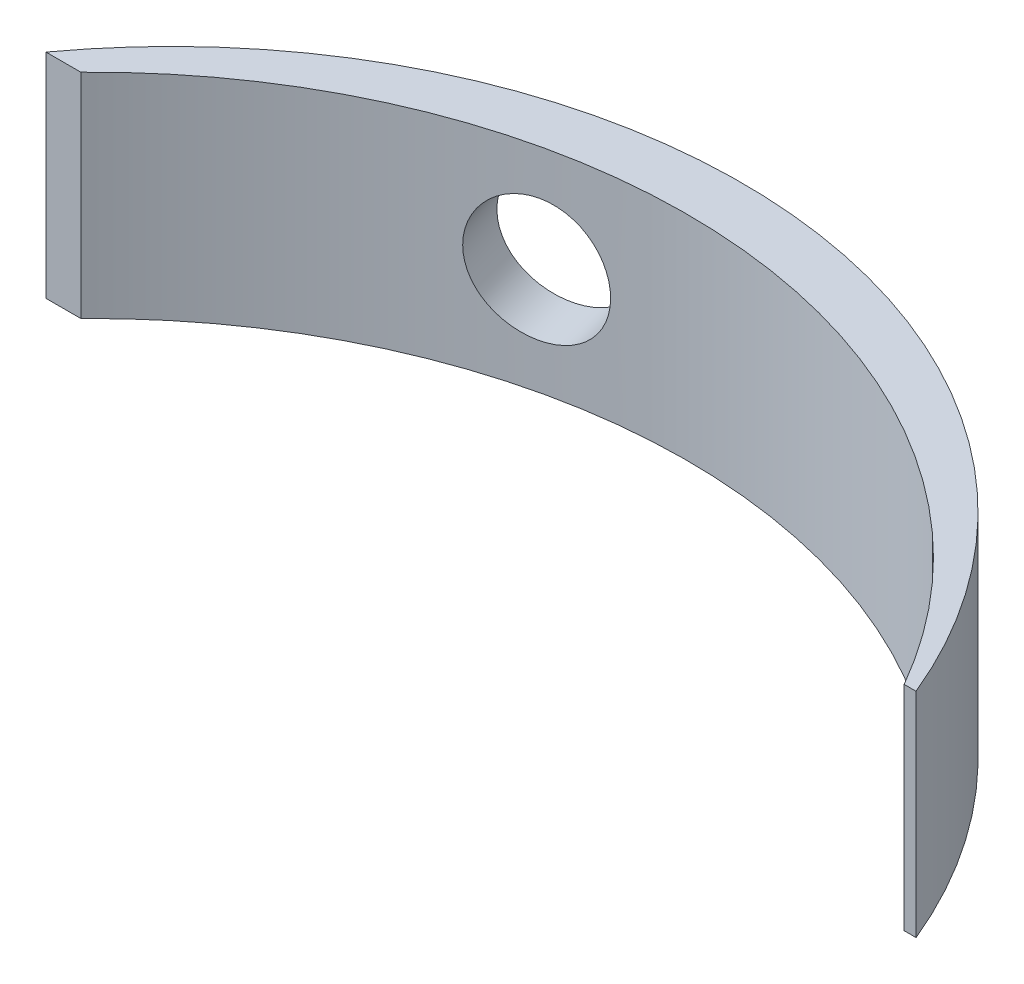
ISO-10303-21;
HEADER;
FILE_DESCRIPTION(('STEP AP214'),'2;1');
FILE_NAME('part.step','',(''),(''),'','','');
FILE_SCHEMA(('AUTOMOTIVE_DESIGN { 1 0 10303 214 1 1 1 1 }'));
ENDSEC;
DATA;
#1=APPLICATION_CONTEXT('core data for automotive mechanical design processes');
#2=APPLICATION_PROTOCOL_DEFINITION('international standard','automotive_design',2000,#1);
#3=PRODUCT_CONTEXT('',#1,'mechanical');
#4=PRODUCT('Part','Part','',(#3));
#5=PRODUCT_RELATED_PRODUCT_CATEGORY('part','',(#4));
#6=PRODUCT_DEFINITION_FORMATION('','',#4);
#7=PRODUCT_DEFINITION_CONTEXT('part definition',#1,'design');
#8=PRODUCT_DEFINITION('design','',#6,#7);
#9=PRODUCT_DEFINITION_SHAPE('','',#8);
#10=(LENGTH_UNIT() NAMED_UNIT(*) SI_UNIT(.MILLI.,.METRE.));
#11=(NAMED_UNIT(*) PLANE_ANGLE_UNIT() SI_UNIT($,.RADIAN.));
#12=(NAMED_UNIT(*) SI_UNIT($,.STERADIAN.) SOLID_ANGLE_UNIT());
#13=UNCERTAINTY_MEASURE_WITH_UNIT(LENGTH_MEASURE(1.E-05),#10,'distance_accuracy_value','');
#14=(GEOMETRIC_REPRESENTATION_CONTEXT(3) GLOBAL_UNCERTAINTY_ASSIGNED_CONTEXT((#13)) GLOBAL_UNIT_ASSIGNED_CONTEXT((#10,
#11,#12)) REPRESENTATION_CONTEXT('',''));
#15=CARTESIAN_POINT('',(0.,0.,0.));
#16=DIRECTION('',(0.,0.,1.));
#17=DIRECTION('',(1.,0.,0.));
#18=AXIS2_PLACEMENT_3D('',#15,#16,#17);
#19=CARTESIAN_POINT('',(141.2875,57.15,58.1840058724832));
#20=DIRECTION('',(0.,-1.,0.));
#21=DIRECTION('',(0.,0.,-1.));
#22=AXIS2_PLACEMENT_3D('',#19,#20,#21);
#23=CYLINDRICAL_SURFACE('',#22,152.799005872483);
#24=CARTESIAN_POINT('',(86.0222558572413,28.575,-84.2705096244305));
#25=CARTESIAN_POINT('',(86.0222515503944,28.1120989758111,-84.2705069842389));
#26=CARTESIAN_POINT('',(86.04048623744,27.6492703304217,-84.2775858667872));
#27=CARTESIAN_POINT('',(86.1133049194062,26.7267608318967,-84.305804245029));
#28=CARTESIAN_POINT('',(86.1678974804124,26.2670807463676,-84.3269470542482));
#29=CARTESIAN_POINT('',(86.3131475939382,25.3538775854863,-84.3830408276301));
#30=CARTESIAN_POINT('',(86.4038399757346,24.9003608948781,-84.4180051266058));
#31=CARTESIAN_POINT('',(86.6207150127373,24.0030819733926,-84.5012852999568));
#32=CARTESIAN_POINT('',(86.7468975958275,23.5593197226962,-84.5496011472017));
#33=CARTESIAN_POINT('',(86.9620759404712,22.9036043290434,-84.631575652475));
#34=CARTESIAN_POINT('',(87.0381089355589,22.6867122787247,-84.6604799602388));
#35=CARTESIAN_POINT('',(87.1986747178071,22.2565992461378,-84.7213563460328));
#36=CARTESIAN_POINT('',(87.2832053217454,22.0433773373347,-84.7533276359919));
#37=CARTESIAN_POINT('',(87.5493953705119,21.4096595127873,-84.8537106403135));
#38=CARTESIAN_POINT('',(87.7436645114961,20.9950765828764,-84.9265958703674));
#39=CARTESIAN_POINT('',(88.1644218912166,20.1849414359681,-85.0833145893145));
#40=CARTESIAN_POINT('',(88.3909034685734,19.7893853068937,-85.1671458143346));
#41=CARTESIAN_POINT('',(88.8746713400905,19.0199124348961,-85.344729760026));
#42=CARTESIAN_POINT('',(89.1319575975992,18.645995666227,-85.4384824688925));
#43=CARTESIAN_POINT('',(89.6764049576062,17.921443116995,-85.6350298155276));
#44=CARTESIAN_POINT('',(89.9636460154305,17.5708739601232,-85.7378485332677));
#45=CARTESIAN_POINT('',(90.5655429967052,16.896604476723,-85.9510737509749));
#46=CARTESIAN_POINT('',(90.8801989929475,16.5729042215412,-86.061480271089));
#47=CARTESIAN_POINT('',(91.5348732798131,15.954646883853,-86.2885948106701));
#48=CARTESIAN_POINT('',(91.8748925562685,15.6600909351779,-86.4053030750276));
#49=CARTESIAN_POINT('',(92.5780359753195,15.1022243783186,-86.6436920631989));
#50=CARTESIAN_POINT('',(92.9411601075039,14.8389137560553,-86.765372784772));
#51=CARTESIAN_POINT('',(93.6884594525961,14.345172118452,-87.0124904276878));
#52=CARTESIAN_POINT('',(94.0726550037301,14.1147736714616,-87.1379309230865));
#53=CARTESIAN_POINT('',(94.8591751771982,13.6888203214894,-87.3911207903362));
#54=CARTESIAN_POINT('',(95.2614998192259,13.4932654563594,-87.5188701646952));
#55=CARTESIAN_POINT('',(96.0815159028412,13.1384181442859,-87.7753710943444));
#56=CARTESIAN_POINT('',(96.4992069619543,12.9791247954914,-87.9041226246278));
#57=CARTESIAN_POINT('',(97.347071698854,12.6979518765491,-88.1613773762201));
#58=CARTESIAN_POINT('',(97.7772453288849,12.5760721632853,-88.289880598477));
#59=CARTESIAN_POINT('',(98.6453007720827,12.3710277325129,-88.5449375765527));
#60=CARTESIAN_POINT('',(99.0831443870586,12.2877084742293,-88.6714971137697));
#61=CARTESIAN_POINT('',(99.9651455716714,12.1596576328693,-88.9221102213036));
#62=CARTESIAN_POINT('',(100.409303124548,12.1149259473793,-89.0461637982706));
#63=CARTESIAN_POINT('',(101.300773062489,12.0643633955629,-89.2907767042696));
#64=CARTESIAN_POINT('',(101.748085382196,12.058531725683,-89.4113361054293));
#65=CARTESIAN_POINT('',(102.642678773969,12.0857917194742,-89.6480883297807));
#66=CARTESIAN_POINT('',(103.089959846065,12.1188833464588,-89.764281157088));
#67=CARTESIAN_POINT('',(103.980041285758,12.2235817925819,-89.9912285040665));
#68=CARTESIAN_POINT('',(104.422850643132,12.2950814740132,-90.1019972206833));
#69=CARTESIAN_POINT('',(105.302071674156,12.4759884265698,-90.3178124895098));
#70=CARTESIAN_POINT('',(105.738483363205,12.5853956064305,-90.4228590554955));
#71=CARTESIAN_POINT('',(106.601785552511,12.8413127547695,-90.6267267489958));
#72=CARTESIAN_POINT('',(107.028675873753,12.987823420207,-90.725547759525));
#73=CARTESIAN_POINT('',(107.869860396199,13.3168828861597,-90.9165762954052));
#74=CARTESIAN_POINT('',(108.284154546397,13.4994318325837,-91.0087837939779));
#75=CARTESIAN_POINT('',(109.098659961975,13.8999963781927,-91.1866378145082));
#76=CARTESIAN_POINT('',(109.498813876352,14.1181398540815,-91.2722589790919));
#77=CARTESIAN_POINT('',(110.280523317159,14.5878610340486,-91.4363908782332));
#78=CARTESIAN_POINT('',(110.662078805175,14.8394388071813,-91.5149015981046));
#79=CARTESIAN_POINT('',(111.403823703038,15.3742660089472,-91.6647354601562));
#80=CARTESIAN_POINT('',(111.764012404391,15.6575164869086,-91.7360583640527));
#81=CARTESIAN_POINT('',(112.460372251684,16.2537052095002,-91.8715130164475));
#82=CARTESIAN_POINT('',(112.796543315286,16.5666435558976,-91.9356447402934));
#83=CARTESIAN_POINT('',(113.444155050499,17.2218259288622,-92.057112000611));
#84=CARTESIAN_POINT('',(113.755450283356,17.56422098973,-92.1144084153545));
#85=CARTESIAN_POINT('',(114.348904519545,18.2744338425496,-92.2219090308153));
#86=CARTESIAN_POINT('',(114.631063402939,18.6422517391431,-92.272113202338));
#87=CARTESIAN_POINT('',(115.164091376434,19.4007339156456,-92.3655771942467));
#88=CARTESIAN_POINT('',(115.414960496663,19.7913981735559,-92.4088370213193));
#89=CARTESIAN_POINT('',(115.883468234323,20.5928281852812,-92.4885790899051));
#90=CARTESIAN_POINT('',(116.10110694393,21.0035938833342,-92.5250613502182));
#91=CARTESIAN_POINT('',(116.501234032199,21.8418807727248,-92.5913844354674));
#92=CARTESIAN_POINT('',(116.683759494648,22.2693837066541,-92.6212322723852));
#93=CARTESIAN_POINT('',(117.012497044133,23.1385211732984,-92.6744979539591));
#94=CARTESIAN_POINT('',(117.158709129941,23.5801557064917,-92.6979157983975));
#95=CARTESIAN_POINT('',(117.413637575048,24.4743819955906,-92.7384628473561));
#96=CARTESIAN_POINT('',(117.522355407898,24.9269733201381,-92.7555922990164));
#97=CARTESIAN_POINT('',(117.701417567114,25.8398725247844,-92.783676560031));
#98=CARTESIAN_POINT('',(117.77176211262,26.3001803608004,-92.7946314046471));
#99=CARTESIAN_POINT('',(117.873148926086,27.2219813944591,-92.8103879850259));
#100=CARTESIAN_POINT('',(117.904459791969,27.6834443479569,-92.8152317748855));
#101=CARTESIAN_POINT('',(117.928414421067,28.6073957051582,-92.8189393520571));
#102=CARTESIAN_POINT('',(117.921058365552,29.0698841040443,-92.8178031674032));
#103=CARTESIAN_POINT('',(117.867739858575,29.9925662383112,-92.8095428431166));
#104=CARTESIAN_POINT('',(117.821778183052,30.4527600196249,-92.8024188238341));
#105=CARTESIAN_POINT('',(117.691622922896,31.3675733814978,-92.7821330765807));
#106=CARTESIAN_POINT('',(117.607429353549,31.8221929642858,-92.7689713510238));
#107=CARTESIAN_POINT('',(117.401815197561,32.7212013622425,-92.7365727038969));
#108=CARTESIAN_POINT('',(117.280512721367,33.165617895304,-92.7173550514113));
#109=CARTESIAN_POINT('',(117.001557003077,34.0425686973351,-92.672711252714));
#110=CARTESIAN_POINT('',(116.843903866996,34.4751030009546,-92.647285124609));
#111=CARTESIAN_POINT('',(116.493480465555,35.3252792790061,-92.5900777293418));
#112=CARTESIAN_POINT('',(116.300709355356,35.7429208948732,-92.5582963092875));
#113=CARTESIAN_POINT('',(115.881545290611,36.5604056815401,-92.4882171401426));
#114=CARTESIAN_POINT('',(115.655152159898,36.9602487590677,-92.4499193569085));
#115=CARTESIAN_POINT('',(115.169234308771,37.7413698714897,-92.3664290214586));
#116=CARTESIAN_POINT('',(114.909546318825,38.1225426874163,-92.3212022626046));
#117=CARTESIAN_POINT('',(114.359925166068,38.8614806243717,-92.2238389034061));
#118=CARTESIAN_POINT('',(114.069991915617,39.2192456775684,-92.1717022830391));
#119=CARTESIAN_POINT('',(113.462045786204,39.9089064311352,-92.0603809228614));
#120=CARTESIAN_POINT('',(113.144031936417,40.2408012363507,-92.0011959393442));
#121=CARTESIAN_POINT('',(112.482292712296,40.8764123829126,-91.8756809619608));
#122=CARTESIAN_POINT('',(112.138567247538,41.180128625152,-91.8093509429665));
#123=CARTESIAN_POINT('',(111.425753169535,41.7590426603478,-91.6690721452277));
#124=CARTESIAN_POINT('',(111.056522077413,42.0340543460987,-91.5950791820544));
#125=CARTESIAN_POINT('',(110.297318593785,42.5514719509362,-91.4398389733313));
#126=CARTESIAN_POINT('',(109.907346107994,42.793877721786,-91.3585916948039));
#127=CARTESIAN_POINT('',(109.10953164929,43.2443500706132,-91.1889529967007));
#128=CARTESIAN_POINT('',(108.701689756252,43.4524168020635,-91.1005616090569));
#129=CARTESIAN_POINT('',(107.87112826195,43.8327077629825,-90.9168431061636));
#130=CARTESIAN_POINT('',(107.448408703582,44.0049320957825,-90.8215160109103));
#131=CARTESIAN_POINT('',(106.591663591981,44.312106588331,-90.6243545050195));
#132=CARTESIAN_POINT('',(106.157651108863,44.4470979090886,-90.5225274347496));
#133=CARTESIAN_POINT('',(105.281038610272,44.6790579553443,-90.3127080133477));
#134=CARTESIAN_POINT('',(104.83843859505,44.7760266819536,-90.204715662396));
#135=CARTESIAN_POINT('',(103.947891918558,44.9312072562735,-89.9831308014225));
#136=CARTESIAN_POINT('',(103.499945419533,44.9894202770389,-89.8695384610127));
#137=CARTESIAN_POINT('',(102.601951777247,45.0666434476513,-89.6374391562937));
#138=CARTESIAN_POINT('',(102.151904643792,45.0856537803122,-89.5189322149053));
#139=CARTESIAN_POINT('',(101.255622296059,45.0843158381762,-89.2785282742703));
#140=CARTESIAN_POINT('',(100.809380253846,45.0641990193546,-89.1566553895938));
#141=CARTESIAN_POINT('',(99.9212181242704,44.9851964904633,-88.9097715875981));
#142=CARTESIAN_POINT('',(99.4792980197056,44.9263109347674,-88.784760682776));
#143=CARTESIAN_POINT('',(98.6029038744666,44.7701888079702,-88.5326236183705));
#144=CARTESIAN_POINT('',(98.1684297615141,44.6729526093589,-88.4054974793433));
#145=CARTESIAN_POINT('',(97.3099607018666,44.4408279408217,-88.1502443186604));
#146=CARTESIAN_POINT('',(96.8859657575858,44.3059394622215,-88.0221172967741));
#147=CARTESIAN_POINT('',(96.0521945281318,43.9997788624396,-87.7663046528457));
#148=CARTESIAN_POINT('',(95.6423923354863,43.8285775955516,-87.6386186563532));
#149=CARTESIAN_POINT('',(94.8389356751125,43.4508625614375,-87.3846878667199));
#150=CARTESIAN_POINT('',(94.4452811796894,43.2443488547785,-87.2584430711075));
#151=CARTESIAN_POINT('',(93.6767692825695,42.7974820316655,-87.0086860504469));
#152=CARTESIAN_POINT('',(93.3019116344182,42.5571293590477,-86.8851737895831));
#153=CARTESIAN_POINT('',(92.5734769888967,42.0442844773649,-86.6421920451495));
#154=CARTESIAN_POINT('',(92.2199000534585,41.7717921747727,-86.5227225733456));
#155=CARTESIAN_POINT('',(91.5350379418162,41.1954777659785,-86.2886911772884));
#156=CARTESIAN_POINT('',(91.2038433196589,40.8915396754598,-86.1741497991046));
#157=CARTESIAN_POINT('',(90.5674210452813,40.2553622515037,-85.9517754190756));
#158=CARTESIAN_POINT('',(90.2621935459035,39.9231227515072,-85.8439424567173));
#159=CARTESIAN_POINT('',(89.679586949993,39.232529995455,-85.6362124361887));
#160=CARTESIAN_POINT('',(89.4022146730583,38.8741703814763,-85.5363173226295));
#161=CARTESIAN_POINT('',(89.0085639826957,38.3191456282334,-85.3933897683242));
#162=CARTESIAN_POINT('',(88.8810770691854,38.1312153112829,-85.3468980532828));
#163=CARTESIAN_POINT('',(88.6337130113828,37.7497722730417,-85.2563380196463));
#164=CARTESIAN_POINT('',(88.5138378303408,37.5562581301152,-85.2122703266541));
#165=CARTESIAN_POINT('',(88.1652175090091,36.9666129917978,-85.0836487119391));
#166=CARTESIAN_POINT('',(87.9483006163582,36.5625398983186,-85.0029759071572));
#167=CARTESIAN_POINT('',(87.5475199191227,35.7363576403059,-84.85304017875));
#168=CARTESIAN_POINT('',(87.3636562156746,35.3142484205901,-84.7837772900368));
#169=CARTESIAN_POINT('',(87.0303142585464,34.4553371961438,-84.6576048504686));
#170=CARTESIAN_POINT('',(86.8808023231566,34.0185500689813,-84.6006832022125));
#171=CARTESIAN_POINT('',(86.6169663287249,33.1331667437494,-84.4998714203724));
#172=CARTESIAN_POINT('',(86.5026338146175,32.6845734113777,-84.4559781556205));
#173=CARTESIAN_POINT('',(86.2787642380704,31.6324306712226,-84.3698231964606));
#174=CARTESIAN_POINT('',(86.1826572670725,31.025551202057,-84.332649907396));
#175=CARTESIAN_POINT('',(86.0544060491956,29.8040719575773,-84.2829949177342));
#176=CARTESIAN_POINT('',(86.0222615743117,29.1894722097912,-84.2705131291201));
#177=CARTESIAN_POINT('',(86.0222558572413,28.575,-84.2705096244305));
#178=B_SPLINE_CURVE_WITH_KNOTS('',3,(#24,#25,#26,#27,#28,#29,#30,#31,#32,#33,#34,#35,#36,#37,
#38,#39,#40,#41,#42,#43,#44,#45,#46,#47,#48,#49,#50,#51,#52,#53,#54,#55,#56,#57,#58,#59,#60,#61,
#62,#63,#64,#65,#66,#67,#68,#69,#70,#71,#72,#73,#74,#75,#76,#77,#78,#79,#80,#81,#82,#83,#84,#85,
#86,#87,#88,#89,#90,#91,#92,#93,#94,#95,#96,#97,#98,#99,#100,#101,#102,#103,#104,#105,#106,#107,
#108,#109,#110,#111,#112,#113,#114,#115,#116,#117,#118,#119,#120,#121,#122,#123,#124,#125,#126,
#127,#128,#129,#130,#131,#132,#133,#134,#135,#136,#137,#138,#139,#140,#141,#142,#143,#144,#145,
#146,#147,#148,#149,#150,#151,#152,#153,#154,#155,#156,#157,#158,#159,#160,#161,#162,#163,#164,
#165,#166,#167,#168,#169,#170,#171,#172,#173,#174,#175,#176,#177),.UNSPECIFIED.,.T.,.F.,(4,2,2,
2,2,2,2,2,2,2,2,2,2,2,2,2,2,2,2,2,2,2,2,2,2,2,2,2,2,2,2,2,2,2,2,2,2,2,2,2,2,2,2,2,2,2,2,2,2,2,2,
2,2,2,2,2,2,2,2,2,2,2,2,2,2,2,2,2,2,2,2,2,2,2,2,2,4),(0.,1.38816742471254,2.77666202393818,
4.16649950900048,5.55633416992986,6.25108705958049,6.94566190595473,8.33470092855645,
9.7234531209747,11.1122036610619,12.5047608341239,13.8973217048096,15.2899367304535,
16.6825511285809,18.0765341856914,19.4705187571287,20.8644686553397,22.2584132212942,
23.646721763657,25.0350266213562,26.4233028009001,27.8115776719439,29.1959999646066,
30.5804189242169,31.9648638909573,33.3493144630418,34.7388529799315,36.1283943667863,
37.5179818032964,38.9075740033524,40.3047724071122,41.7019765621543,43.0991793718557,
44.4963783059007,45.8920934309337,47.2878086031953,48.6834689165903,50.0791212595846,
51.465115880955,52.8511040048005,54.2370642721987,55.6230239854469,57.0046175610435,
58.3862071073274,59.7678298951308,61.149459922394,62.5381446414441,63.9268333845058,
65.3155701572444,66.7043118141291,68.1015611332715,69.4988168045322,70.896066230811,
72.293311628859,73.6890061271378,75.0847005846292,76.48035279543,77.8759984978746,
79.2634133877522,80.6508227530959,82.0382186432174,83.4256148529644,84.8103284475265,
86.1950396670784,87.5797327262769,88.9644298150735,90.3544297411837,91.7444378482732,
93.1347854358668,93.8300146865396,94.5254225313626,95.9205863098039,97.3157543571045,
98.7095485562721,100.103007507091,101.945719666043,103.788425256332),.UNSPECIFIED.);
#179=CARTESIAN_POINT('',(86.0222558572413,28.575,-84.2705096244305));
#180=VERTEX_POINT('',#179);
#181=EDGE_CURVE('E87',#180,#180,#178,.T.);
#182=ORIENTED_EDGE('',*,*,#181,.T.);
#183=EDGE_LOOP('',(#182));
#184=FACE_BOUND('',#183,.T.);
#185=DIRECTION('',(0.,-1.,0.));
#186=VECTOR('',#185,1.);
#187=CARTESIAN_POINT('',(17.7585123762551,57.15,-31.75));
#188=LINE('',#187,#186);
#189=CARTESIAN_POINT('',(17.7585123762551,57.15,-31.75));
#190=VERTEX_POINT('',#189);
#191=CARTESIAN_POINT('',(17.7585123762551,0.,-31.75));
#192=VERTEX_POINT('',#191);
#193=EDGE_CURVE('E49',#190,#192,#188,.T.);
#194=ORIENTED_EDGE('',*,*,#193,.F.);
#195=CARTESIAN_POINT('',(141.2875,57.15,58.1840058724832));
#196=DIRECTION('',(0.,1.,0.));
#197=DIRECTION('',(0.,0.,-1.));
#198=AXIS2_PLACEMENT_3D('',#195,#196,#197);
#199=CIRCLE('',#198,152.799005872483);
#200=CARTESIAN_POINT('',(282.575,57.15,0.));
#201=VERTEX_POINT('',#200);
#202=EDGE_CURVE('E79',#201,#190,#199,.T.);
#203=ORIENTED_EDGE('',*,*,#202,.F.);
#204=DIRECTION('',(0.,-1.,0.));
#205=VECTOR('',#204,1.);
#206=CARTESIAN_POINT('',(282.575,57.15,0.));
#207=LINE('',#206,#205);
#208=CARTESIAN_POINT('',(282.575,0.,0.));
#209=VERTEX_POINT('',#208);
#210=EDGE_CURVE('E73',#201,#209,#207,.T.);
#211=ORIENTED_EDGE('',*,*,#210,.T.);
#212=CARTESIAN_POINT('',(141.2875,0.,58.1840058724832));
#213=DIRECTION('',(0.,1.,0.));
#214=DIRECTION('',(0.,0.,-1.));
#215=AXIS2_PLACEMENT_3D('',#212,#213,#214);
#216=CIRCLE('',#215,152.799005872483);
#217=EDGE_CURVE('E84',#209,#192,#216,.T.);
#218=ORIENTED_EDGE('',*,*,#217,.T.);
#219=EDGE_LOOP('',(#194,#203,#211,#218));
#220=FACE_BOUND('',#219,.T.);
#221=ADVANCED_FACE('F34',(#184,#220),#23,.T.);
#222=CARTESIAN_POINT('',(141.2875,57.15,79.1992410714286));
#223=DIRECTION('',(0.,-1.,0.));
#224=DIRECTION('',(0.,0.,-1.));
#225=AXIS2_PLACEMENT_3D('',#222,#223,#224);
#226=CYLINDRICAL_SURFACE('',#225,159.209241071429);
#227=CARTESIAN_POINT('',(89.7063114149867,28.575,-71.4226810604363));
#228=CARTESIAN_POINT('',(89.7063071899196,29.038659604115,-71.4226787165995));
#229=CARTESIAN_POINT('',(89.7248188140627,29.5022481762504,-71.429022575401));
#230=CARTESIAN_POINT('',(89.7987456936112,30.4262801358477,-71.4543092254035));
#231=CARTESIAN_POINT('',(89.8541697078764,30.8867227506083,-71.4732550068856));
#232=CARTESIAN_POINT('',(90.0016383511833,31.801457795601,-71.5235139361024));
#233=CARTESIAN_POINT('',(90.0937186768308,32.2557437831636,-71.5548391389333));
#234=CARTESIAN_POINT('',(90.3139232938691,33.1545563675257,-71.629438045611));
#235=CARTESIAN_POINT('',(90.4420474544561,33.599082999736,-71.6727117060967));
#236=CARTESIAN_POINT('',(90.6605542577229,34.2559520032564,-71.7461154321919));
#237=CARTESIAN_POINT('',(90.7377701775766,34.4732397124487,-71.7719967327247));
#238=CARTESIAN_POINT('',(90.9008383230695,34.9041364681164,-71.8264989921598));
#239=CARTESIAN_POINT('',(90.9866883347208,35.1177464412806,-71.8551192486373));
#240=CARTESIAN_POINT('',(91.2570396689211,35.752613103266,-71.9449669658079));
#241=CARTESIAN_POINT('',(91.4543539738738,36.1679416534965,-72.0101853140129));
#242=CARTESIAN_POINT('',(91.8817175141064,36.9794933181517,-72.1503595743965));
#243=CARTESIAN_POINT('',(92.1117595806771,37.3757205911524,-72.2253133538081));
#244=CARTESIAN_POINT('',(92.6031348893398,38.1464332469907,-72.3840088843846));
#245=CARTESIAN_POINT('',(92.8644680412874,38.5209186924583,-72.4677506102328));
#246=CARTESIAN_POINT('',(93.4169574173246,39.2458085375131,-72.6430377350056));
#247=CARTESIAN_POINT('',(93.708140571141,39.5961907072116,-72.7345901677879));
#248=CARTESIAN_POINT('',(94.318212046769,40.2700160976674,-72.9242957112149));
#249=CARTESIAN_POINT('',(94.6371004118985,40.5934592763033,-73.0224488321799));
#250=CARTESIAN_POINT('',(95.3004696840664,41.2111106868926,-73.2241680364976));
#251=CARTESIAN_POINT('',(95.6449512839507,41.5053181268878,-73.3277342663684));
#252=CARTESIAN_POINT('',(96.3571878791883,42.0623884890863,-73.5390561816631));
#253=CARTESIAN_POINT('',(96.7249428358002,42.3252514634642,-73.646811860113));
#254=CARTESIAN_POINT('',(97.4808029340766,42.8174725875005,-73.8651580532482));
#255=CARTESIAN_POINT('',(97.868884393541,43.0468685988923,-73.9757451954461));
#256=CARTESIAN_POINT('',(98.6631303707827,43.4708748468469,-74.1986587131142));
#257=CARTESIAN_POINT('',(99.0692948769156,43.6654851058091,-74.3109850874645));
#258=CARTESIAN_POINT('',(99.896893012631,44.0185288733095,-74.5361939397528));
#259=CARTESIAN_POINT('',(100.318326269805,44.1769632634979,-74.6490764040697));
#260=CARTESIAN_POINT('',(101.173533383096,44.4565396265597,-74.874272640169));
#261=CARTESIAN_POINT('',(101.607307210613,44.5776816858532,-74.9865864132685));
#262=CARTESIAN_POINT('',(102.482784569729,44.7815118563462,-75.209242723182));
#263=CARTESIAN_POINT('',(102.924459305836,44.8643181697976,-75.3195902968739));
#264=CARTESIAN_POINT('',(103.813936256917,44.9914749426523,-75.5377103640666));
#265=CARTESIAN_POINT('',(104.261738456893,45.0358254961741,-75.6454828638691));
#266=CARTESIAN_POINT('',(105.160304111502,45.0857999365579,-75.8575912803879));
#267=CARTESIAN_POINT('',(105.611067550964,45.0914240216614,-75.9619272146932));
#268=CARTESIAN_POINT('',(106.512363969769,45.0639592465681,-76.1664111732569));
#269=CARTESIAN_POINT('',(106.962896948701,45.0308703177265,-76.2665591900891));
#270=CARTESIAN_POINT('',(107.86083849156,44.9262360071342,-76.4620965396994));
#271=CARTESIAN_POINT('',(108.308244734869,44.8546646168765,-76.5574826063934));
#272=CARTESIAN_POINT('',(109.196444323,44.6736122873159,-76.7429033976446));
#273=CARTESIAN_POINT('',(109.6372376691,44.5641313553318,-76.8329381232348));
#274=CARTESIAN_POINT('',(110.509095927584,44.3080779804101,-77.0072566804885));
#275=CARTESIAN_POINT('',(110.940160501967,44.1615042509313,-77.0915403125499));
#276=CARTESIAN_POINT('',(111.789485326352,43.8323353880588,-77.2540635865641));
#277=CARTESIAN_POINT('',(112.207745506752,43.6497400588979,-77.332303195666));
#278=CARTESIAN_POINT('',(113.031163210876,43.248524411003,-77.4830432423089));
#279=CARTESIAN_POINT('',(113.436217602429,43.0296771121692,-77.5555029627066));
#280=CARTESIAN_POINT('',(114.22741681676,42.558357437342,-77.6940209461451));
#281=CARTESIAN_POINT('',(114.613561557932,42.3058849162536,-77.760079181561));
#282=CARTESIAN_POINT('',(115.364151633863,41.7690687210615,-77.8857909427121));
#283=CARTESIAN_POINT('',(115.728596155686,41.4847238541002,-77.9454442285714));
#284=CARTESIAN_POINT('',(116.433102136892,40.8861381477964,-78.0584094677302));
#285=CARTESIAN_POINT('',(116.773163540377,40.5718972399217,-78.1117214064925));
#286=CARTESIAN_POINT('',(117.428044522696,39.9140147025058,-78.2123822733464));
#287=CARTESIAN_POINT('',(117.742727152115,39.5702318767882,-78.2596995459795));
#288=CARTESIAN_POINT('',(118.342528252118,38.857038805713,-78.3482204962368));
#289=CARTESIAN_POINT('',(118.627646591375,38.4876284465274,-78.3894241467041));
#290=CARTESIAN_POINT('',(119.166111978598,37.725763596636,-78.4659123818785));
#291=CARTESIAN_POINT('',(119.419459510589,37.3333094571334,-78.5011970567632));
#292=CARTESIAN_POINT('',(119.892393098875,36.5281100944904,-78.5660556243527));
#293=CARTESIAN_POINT('',(120.111979355033,36.1153649914883,-78.5956295508644));
#294=CARTESIAN_POINT('',(120.514693014299,35.2744648686754,-78.6491483005359));
#295=CARTESIAN_POINT('',(120.697984741853,34.8463901717063,-78.673118587815));
#296=CARTESIAN_POINT('',(121.027889296477,33.9760757561431,-78.7157940119509));
#297=CARTESIAN_POINT('',(121.174502199389,33.5338360668399,-78.7344991596944));
#298=CARTESIAN_POINT('',(121.429832333548,32.6383939664786,-78.7668060862324));
#299=CARTESIAN_POINT('',(121.538551871289,32.1851922244544,-78.7804081756434));
#300=CARTESIAN_POINT('',(121.71719743786,31.2710865277119,-78.802638089851));
#301=CARTESIAN_POINT('',(121.787123790664,30.8101826373495,-78.8112659561887));
#302=CARTESIAN_POINT('',(121.887043946371,29.8891024407133,-78.8235650495794));
#303=CARTESIAN_POINT('',(121.91746583487,29.4289732380797,-78.8272894190637));
#304=CARTESIAN_POINT('',(121.939530338611,28.5077738699563,-78.8299924257914));
#305=CARTESIAN_POINT('',(121.931173249721,28.0467037116724,-78.8289710992425));
#306=CARTESIAN_POINT('',(121.875750657762,27.1269461510898,-78.8221726811819));
#307=CARTESIAN_POINT('',(121.828686319816,26.6682586774884,-78.8163957328189));
#308=CARTESIAN_POINT('',(121.696241566194,25.7565373759346,-78.8000294278557));
#309=CARTESIAN_POINT('',(121.61086116382,25.3035035460195,-78.7894400729264));
#310=CARTESIAN_POINT('',(121.4029524404,24.408316047096,-78.7634067915481));
#311=CARTESIAN_POINT('',(121.280591207769,23.9661229164206,-78.7479846893133));
#312=CARTESIAN_POINT('',(120.999578474551,23.0936353359259,-78.7121351083741));
#313=CARTESIAN_POINT('',(120.840927130599,22.6633408347585,-78.6917076512738));
#314=CARTESIAN_POINT('',(120.488588546453,21.8176182225327,-78.6456805060738));
#315=CARTESIAN_POINT('',(120.294900264544,21.4021905539334,-78.6200806641866));
#316=CARTESIAN_POINT('',(119.874001224223,20.5890607851267,-78.5635225197689));
#317=CARTESIAN_POINT('',(119.646790213995,20.1913588181004,-78.5325641769861));
#318=CARTESIAN_POINT('',(119.158776792057,19.4134993785593,-78.464842221009));
#319=CARTESIAN_POINT('',(118.897737290963,19.0334942543325,-78.4280371751399));
#320=CARTESIAN_POINT('',(118.345389846129,18.2968099257255,-78.3485924419654));
#321=CARTESIAN_POINT('',(118.05408178193,17.9401308141842,-78.3059527314398));
#322=CARTESIAN_POINT('',(117.443361297671,17.2525018471912,-78.2146553775817));
#323=CARTESIAN_POINT('',(117.123947406214,16.9215533404985,-78.1659974191276));
#324=CARTESIAN_POINT('',(116.459379906294,16.2876470478833,-78.0625151117778));
#325=CARTESIAN_POINT('',(116.114226134099,15.9846894400388,-78.0076907236562));
#326=CARTESIAN_POINT('',(115.397000070638,15.4058475492211,-77.8911716802936));
#327=CARTESIAN_POINT('',(115.024686673619,15.130275040376,-77.8294119435911));
#328=CARTESIAN_POINT('',(114.259075901248,14.6117232677357,-77.6994442959552));
#329=CARTESIAN_POINT('',(113.865778373552,14.3687442406123,-77.6312363382053));
#330=CARTESIAN_POINT('',(113.061059913792,13.9170907344998,-77.4884019974778));
#331=CARTESIAN_POINT('',(112.649638740839,13.7084167116449,-77.4137755291769));
#332=CARTESIAN_POINT('',(111.811662533499,13.3268720765455,-77.2582260701814));
#333=CARTESIAN_POINT('',(111.385107521776,13.1540014106861,-77.1773030889159));
#334=CARTESIAN_POINT('',(110.519157586492,12.8450433003208,-77.0092299215843));
#335=CARTESIAN_POINT('',(110.079740607166,12.7090237056334,-76.922068617458));
#336=CARTESIAN_POINT('',(109.192003878342,12.4752087166955,-76.7419872211417));
#337=CARTESIAN_POINT('',(108.743684108029,12.3774134118325,-76.6490671154853));
#338=CARTESIAN_POINT('',(107.841412302467,12.220810698549,-76.4579280521717));
#339=CARTESIAN_POINT('',(107.387460433262,12.1620021435027,-76.3597092504446));
#340=CARTESIAN_POINT('',(106.477211436262,12.0838544286648,-76.1585508036466));
#341=CARTESIAN_POINT('',(106.020914322752,12.0645150287476,-76.0556111873005));
#342=CARTESIAN_POINT('',(105.112234488581,12.0655002665026,-75.8463927763697));
#343=CARTESIAN_POINT('',(104.659845524027,12.085569460168,-75.7401398512451));
#344=CARTESIAN_POINT('',(103.759259545024,12.1647706869709,-75.5244739943464));
#345=CARTESIAN_POINT('',(103.311062514336,12.2239025687167,-75.4150610748207));
#346=CARTESIAN_POINT('',(102.422066020781,12.3808433334144,-75.1939915771479));
#347=CARTESIAN_POINT('',(101.981266377912,12.4786512738319,-75.0823350537401));
#348=CARTESIAN_POINT('',(101.110178441359,12.7122706780319,-74.8577860077264));
#349=CARTESIAN_POINT('',(100.679890120824,12.8480820447294,-74.7448934882787));
#350=CARTESIAN_POINT('',(99.8350894951487,13.1559346977165,-74.5195614116892));
#351=CARTESIAN_POINT('',(99.4205059132604,13.3277809871943,-74.4071226085337));
#352=CARTESIAN_POINT('',(98.6075962441752,13.7069154933672,-74.1832416833952));
#353=CARTESIAN_POINT('',(98.2092700951236,13.9142035752012,-74.0717995576214));
#354=CARTESIAN_POINT('',(97.4316068982969,14.3627464849946,-73.8510985975457));
#355=CARTESIAN_POINT('',(97.0522692872559,14.6040003046021,-73.7418396985395));
#356=CARTESIAN_POINT('',(96.3151349492942,15.1187673936698,-73.5267104474449));
#357=CARTESIAN_POINT('',(95.9573382511266,15.392280706189,-73.4208400998797));
#358=CARTESIAN_POINT('',(95.2653917733409,15.9698721591995,-73.2136145700145));
#359=CARTESIAN_POINT('',(94.931261740173,16.2739753223286,-73.1122631836649));
#360=CARTESIAN_POINT('',(94.2892016833035,16.910389862769,-72.9153709492434));
#361=CARTESIAN_POINT('',(93.9812717548803,17.2427013426527,-72.8198301223025));
#362=CARTESIAN_POINT('',(93.3935281359456,17.9333315391205,-72.6356850253804));
#363=CARTESIAN_POINT('',(93.1137212887632,18.2916565493487,-72.5470824448703));
#364=CARTESIAN_POINT('',(92.7166398700467,18.8465403165439,-72.4202606464347));
#365=CARTESIAN_POINT('',(92.5880461226617,19.0344089087345,-72.378998844396));
#366=CARTESIAN_POINT('',(92.3385440443881,19.4156970711063,-72.29861148336));
#367=CARTESIAN_POINT('',(92.217637684431,19.6091180465332,-72.2594864725638));
#368=CARTESIAN_POINT('',(91.866043007346,20.1984189650452,-72.1452763429622));
#369=CARTESIAN_POINT('',(91.6472990465686,20.6021908855254,-72.0736187761173));
#370=CARTESIAN_POINT('',(91.2431823632006,21.4276352380156,-71.9404096086842));
#371=CARTESIAN_POINT('',(91.0578098165452,21.8493077643836,-71.8788580613753));
#372=CARTESIAN_POINT('',(90.7217688867153,22.7072171941898,-71.7667175352579));
#373=CARTESIAN_POINT('',(90.5710668202599,23.1434394862292,-71.7161179192146));
#374=CARTESIAN_POINT('',(90.3051651610423,24.0275758157306,-71.6264981557189));
#375=CARTESIAN_POINT('',(90.1899571144816,24.4754870415669,-71.5874752510623));
#376=CARTESIAN_POINT('',(89.9645096892288,25.5254760234187,-71.5109172160925));
#377=CARTESIAN_POINT('',(89.8677676145137,26.1308352329864,-71.4778911144308));
#378=CARTESIAN_POINT('',(89.7386712944239,27.3491709985078,-71.4337745940414));
#379=CARTESIAN_POINT('',(89.7063169995636,27.9621475486068,-71.422684158455));
#380=CARTESIAN_POINT('',(89.7063114149867,28.575,-71.4226810604363));
#381=B_SPLINE_CURVE_WITH_KNOTS('',3,(#227,#228,#229,#230,#231,#232,#233,#234,#235,#236,#237,
#238,#239,#240,#241,#242,#243,#244,#245,#246,#247,#248,#249,#250,#251,#252,#253,#254,#255,#256,
#257,#258,#259,#260,#261,#262,#263,#264,#265,#266,#267,#268,#269,#270,#271,#272,#273,#274,#275,
#276,#277,#278,#279,#280,#281,#282,#283,#284,#285,#286,#287,#288,#289,#290,#291,#292,#293,#294,
#295,#296,#297,#298,#299,#300,#301,#302,#303,#304,#305,#306,#307,#308,#309,#310,#311,#312,#313,
#314,#315,#316,#317,#318,#319,#320,#321,#322,#323,#324,#325,#326,#327,#328,#329,#330,#331,#332,
#333,#334,#335,#336,#337,#338,#339,#340,#341,#342,#343,#344,#345,#346,#347,#348,#349,#350,#351,
#352,#353,#354,#355,#356,#357,#358,#359,#360,#361,#362,#363,#364,#365,#366,#367,#368,#369,#370,
#371,#372,#373,#374,#375,#376,#377,#378,#379,#380),.UNSPECIFIED.,.T.,.F.,(4,2,2,2,2,2,2,2,2,2,2,
2,2,2,2,2,2,2,2,2,2,2,2,2,2,2,2,2,2,2,2,2,2,2,2,2,2,2,2,2,2,2,2,2,2,2,2,2,2,2,2,2,2,2,2,2,2,2,2,
2,2,2,2,2,2,2,2,2,2,2,2,2,2,2,2,2,4),(0.,1.39044577402833,2.78122160148523,4.17335511873377,
5.56548358396499,6.26144860865133,6.95723562406778,8.34869835221922,9.73985676142827,
11.1310111630455,12.5234318536853,13.9158547214471,15.3083152978561,16.7007735564068,
18.0916440803586,19.4825137086958,20.8733494362183,22.2641819406313,23.6506969918645,
25.0372086496674,26.4237132098891,27.8102202286234,29.1976655030592,30.5851105096355,
31.9726036454953,33.3601043221879,34.7566457036667,36.1531931115062,37.5497928041308,
38.9463956983267,40.3500906674608,41.7537918716795,43.1574716880683,44.5611431945802,
45.9583064375981,47.3554667916967,48.7525420886506,50.1496057180642,51.5314002943598,
52.9131843281368,54.2949267704761,55.6766687331018,57.0522586842144,58.4278426981001,
59.8034676174389,61.1791028707187,62.5649612989653,63.9508252426795,65.3367617823581,
66.7227071387531,68.1229600964894,69.5232232213713,70.9235049632605,72.3237846082347,
73.7266251780217,75.129469028334,76.5322716182629,77.9350656736799,79.3287969182665,
80.7225227613252,82.1162146414211,83.5099029611707,84.896235691464,86.2825631466832,
87.66884945422,89.0551376121496,90.44256912704,91.8300056871982,93.2177790459501,
93.9117219379716,94.6058420350801,95.9983686983342,97.390902702823,98.7820780564326,
100.172921809839,102.010776021194,103.848628820057),.UNSPECIFIED.);
#382=CARTESIAN_POINT('',(89.7063114149867,28.575,-71.4226810604363));
#383=VERTEX_POINT('',#382);
#384=EDGE_CURVE('E91',#383,#383,#381,.T.);
#385=ORIENTED_EDGE('',*,*,#384,.T.);
#386=EDGE_LOOP('',(#385));
#387=FACE_BOUND('',#386,.T.);
#388=DIRECTION('',(0.,-1.,0.));
#389=VECTOR('',#388,1.);
#390=CARTESIAN_POINT('',(27.104102134048,57.15,-31.75));
#391=LINE('',#390,#389);
#392=CARTESIAN_POINT('',(27.104102134048,0.,-31.75));
#393=VERTEX_POINT('',#392);
#394=CARTESIAN_POINT('',(27.104102134048,57.15,-31.75));
#395=VERTEX_POINT('',#394);
#396=EDGE_CURVE('E127',#393,#395,#391,.F.);
#397=ORIENTED_EDGE('',*,*,#396,.F.);
#398=CARTESIAN_POINT('',(141.2875,0.,79.1992410714286));
#399=DIRECTION('',(0.,-1.,0.));
#400=DIRECTION('',(0.,0.,-1.));
#401=AXIS2_PLACEMENT_3D('',#398,#399,#400);
#402=CIRCLE('',#401,159.209241071429);
#403=CARTESIAN_POINT('',(279.4,0.,0.));
#404=VERTEX_POINT('',#403);
#405=EDGE_CURVE('E80',#393,#404,#402,.T.);
#406=ORIENTED_EDGE('',*,*,#405,.T.);
#407=DIRECTION('',(0.,-1.,0.));
#408=VECTOR('',#407,1.);
#409=CARTESIAN_POINT('',(279.4,57.15,0.));
#410=LINE('',#409,#408);
#411=CARTESIAN_POINT('',(279.4,57.15,0.));
#412=VERTEX_POINT('',#411);
#413=EDGE_CURVE('E42',#412,#404,#410,.T.);
#414=ORIENTED_EDGE('',*,*,#413,.F.);
#415=CARTESIAN_POINT('',(141.2875,57.15,79.1992410714286));
#416=DIRECTION('',(0.,-1.,0.));
#417=DIRECTION('',(0.,0.,-1.));
#418=AXIS2_PLACEMENT_3D('',#415,#416,#417);
#419=CIRCLE('',#418,159.209241071429);
#420=EDGE_CURVE('E118',#395,#412,#419,.T.);
#421=ORIENTED_EDGE('',*,*,#420,.F.);
#422=EDGE_LOOP('',(#397,#406,#414,#421));
#423=FACE_BOUND('',#422,.T.);
#424=ADVANCED_FACE('F100',(#387,#423),#226,.F.);
#425=CARTESIAN_POINT('',(141.2875,57.15,58.1840058724832));
#426=DIRECTION('',(0.,-1.,0.));
#427=DIRECTION('',(0.,0.,-1.));
#428=AXIS2_PLACEMENT_3D('',#425,#426,#427);
#429=PLANE('',#428);
#430=DIRECTION('',(-1.,0.,0.));
#431=VECTOR('',#430,1.);
#432=CARTESIAN_POINT('',(0.,57.15,-31.75));
#433=LINE('',#432,#431);
#434=EDGE_CURVE('E122',#395,#190,#433,.T.);
#435=ORIENTED_EDGE('',*,*,#434,.F.);
#436=ORIENTED_EDGE('',*,*,#420,.T.);
#437=DIRECTION('',(1.,0.,0.));
#438=VECTOR('',#437,1.);
#439=CARTESIAN_POINT('',(279.4,57.15,0.));
#440=LINE('',#439,#438);
#441=EDGE_CURVE('E57',#412,#201,#440,.T.);
#442=ORIENTED_EDGE('',*,*,#441,.T.);
#443=ORIENTED_EDGE('',*,*,#202,.T.);
#444=EDGE_LOOP('',(#435,#436,#442,#443));
#445=FACE_BOUND('',#444,.T.);
#446=ADVANCED_FACE('F110',(#445),#429,.F.);
#447=CARTESIAN_POINT('',(141.2875,0.,58.1840058724832));
#448=DIRECTION('',(0.,-1.,0.));
#449=DIRECTION('',(0.,0.,-1.));
#450=AXIS2_PLACEMENT_3D('',#447,#448,#449);
#451=PLANE('',#450);
#452=ORIENTED_EDGE('',*,*,#405,.F.);
#453=DIRECTION('',(-1.,0.,0.));
#454=VECTOR('',#453,1.);
#455=CARTESIAN_POINT('',(141.2875,0.,-31.75));
#456=LINE('',#455,#454);
#457=EDGE_CURVE('E11',#393,#192,#456,.T.);
#458=ORIENTED_EDGE('',*,*,#457,.T.);
#459=ORIENTED_EDGE('',*,*,#217,.F.);
#460=DIRECTION('',(1.,0.,0.));
#461=VECTOR('',#460,1.);
#462=CARTESIAN_POINT('',(279.4,0.,0.));
#463=LINE('',#462,#461);
#464=EDGE_CURVE('E70',#404,#209,#463,.T.);
#465=ORIENTED_EDGE('',*,*,#464,.F.);
#466=EDGE_LOOP('',(#452,#458,#459,#465));
#467=FACE_BOUND('',#466,.T.);
#468=ADVANCED_FACE('F86',(#467),#451,.T.);
#469=CARTESIAN_POINT('',(279.4,57.15,0.));
#470=DIRECTION('',(0.,0.,-1.));
#471=DIRECTION('',(-1.,0.,0.));
#472=AXIS2_PLACEMENT_3D('',#469,#470,#471);
#473=PLANE('',#472);
#474=ORIENTED_EDGE('',*,*,#464,.T.);
#475=ORIENTED_EDGE('',*,*,#210,.F.);
#476=ORIENTED_EDGE('',*,*,#441,.F.);
#477=ORIENTED_EDGE('',*,*,#413,.T.);
#478=EDGE_LOOP('',(#474,#475,#476,#477));
#479=FACE_BOUND('',#478,.T.);
#480=ADVANCED_FACE('F72',(#479),#473,.F.);
#481=CARTESIAN_POINT('',(139.154251524634,28.575,41.1252378473837));
#482=DIRECTION('',(-0.275637355816986,0.,-0.961261695938323));
#483=DIRECTION('',(-0.961261695938323,0.,0.275637355816986));
#484=AXIS2_PLACEMENT_3D('',#481,#482,#483);
#485=CYLINDRICAL_SURFACE('',#484,16.51);
#486=ORIENTED_EDGE('',*,*,#384,.F.);
#487=EDGE_LOOP('',(#486));
#488=FACE_BOUND('',#487,.T.);
#489=ORIENTED_EDGE('',*,*,#181,.F.);
#490=EDGE_LOOP('',(#489));
#491=FACE_BOUND('',#490,.T.);
#492=ADVANCED_FACE('F103',(#488,#491),#485,.F.);
#493=CARTESIAN_POINT('',(0.,57.15,-31.75));
#494=DIRECTION('',(0.,0.,1.));
#495=DIRECTION('',(1.,0.,0.));
#496=AXIS2_PLACEMENT_3D('',#493,#494,#495);
#497=PLANE('',#496);
#498=ORIENTED_EDGE('',*,*,#193,.T.);
#499=ORIENTED_EDGE('',*,*,#457,.F.);
#500=ORIENTED_EDGE('',*,*,#396,.T.);
#501=ORIENTED_EDGE('',*,*,#434,.T.);
#502=EDGE_LOOP('',(#498,#499,#500,#501));
#503=FACE_BOUND('',#502,.T.);
#504=ADVANCED_FACE('F108',(#503),#497,.T.);
#505=CLOSED_SHELL('',(#221,#424,#446,#468,#480,#492,#504));
#506=MANIFOLD_SOLID_BREP('B2',#505);
#507=ADVANCED_BREP_SHAPE_REPRESENTATION('',(#18,#506),#14);
#508=SHAPE_DEFINITION_REPRESENTATION(#9,#507);
ENDSEC;
END-ISO-10303-21;
